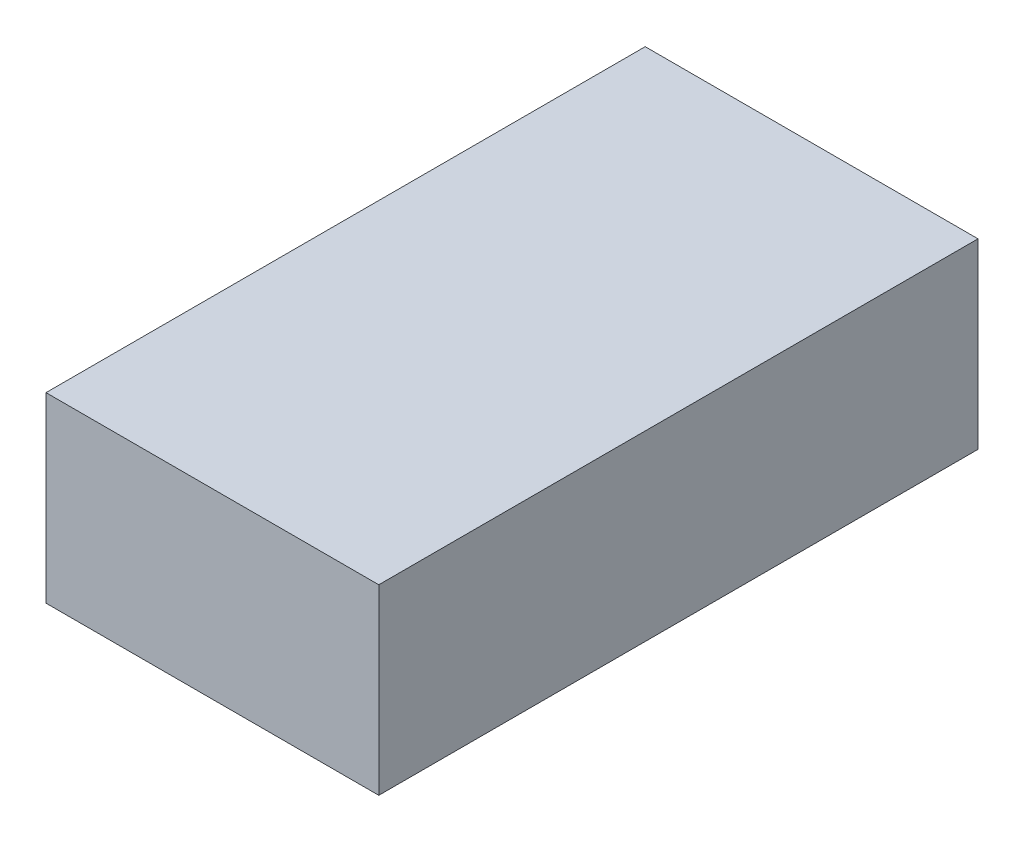
ISO-10303-21;
HEADER;
FILE_DESCRIPTION(('STEP AP214'),'2;1');
FILE_NAME('part.step','',(''),(''),'','','');
FILE_SCHEMA(('AUTOMOTIVE_DESIGN { 1 0 10303 214 1 1 1 1 }'));
ENDSEC;
DATA;
#1=APPLICATION_CONTEXT('core data for automotive mechanical design processes');
#2=APPLICATION_PROTOCOL_DEFINITION('international standard','automotive_design',2000,#1);
#3=PRODUCT_CONTEXT('',#1,'mechanical');
#4=PRODUCT('Part','Part','',(#3));
#5=PRODUCT_RELATED_PRODUCT_CATEGORY('part','',(#4));
#6=PRODUCT_DEFINITION_FORMATION('','',#4);
#7=PRODUCT_DEFINITION_CONTEXT('part definition',#1,'design');
#8=PRODUCT_DEFINITION('design','',#6,#7);
#9=PRODUCT_DEFINITION_SHAPE('','',#8);
#10=(LENGTH_UNIT() NAMED_UNIT(*) SI_UNIT(.MILLI.,.METRE.));
#11=(NAMED_UNIT(*) PLANE_ANGLE_UNIT() SI_UNIT($,.RADIAN.));
#12=(NAMED_UNIT(*) SI_UNIT($,.STERADIAN.) SOLID_ANGLE_UNIT());
#13=UNCERTAINTY_MEASURE_WITH_UNIT(LENGTH_MEASURE(1.E-05),#10,'distance_accuracy_value','');
#14=(GEOMETRIC_REPRESENTATION_CONTEXT(3) GLOBAL_UNCERTAINTY_ASSIGNED_CONTEXT((#13)) GLOBAL_UNIT_ASSIGNED_CONTEXT((#10,
#11,#12)) REPRESENTATION_CONTEXT('',''));
#15=CARTESIAN_POINT('',(0.,0.,0.));
#16=DIRECTION('',(0.,0.,1.));
#17=DIRECTION('',(1.,0.,0.));
#18=AXIS2_PLACEMENT_3D('',#15,#16,#17);
#19=CARTESIAN_POINT('',(-20.0525,15.5175,57.113));
#20=DIRECTION('',(1.,0.,0.));
#21=DIRECTION('',(0.,0.,-1.));
#22=AXIS2_PLACEMENT_3D('',#19,#20,#21);
#23=PLANE('',#22);
#24=DIRECTION('',(0.,-1.,0.));
#25=VECTOR('',#24,1.);
#26=CARTESIAN_POINT('',(-20.0525,15.5175,0.));
#27=LINE('',#26,#25);
#28=CARTESIAN_POINT('',(-20.0525,15.5175,0.));
#29=VERTEX_POINT('',#28);
#30=CARTESIAN_POINT('',(-20.0525,-1.8635,0.));
#31=VERTEX_POINT('',#30);
#32=EDGE_CURVE('E101',#29,#31,#27,.T.);
#33=ORIENTED_EDGE('',*,*,#32,.T.);
#34=DIRECTION('',(0.,0.,-1.));
#35=VECTOR('',#34,1.);
#36=CARTESIAN_POINT('',(-20.0525,-1.8635,57.113));
#37=LINE('',#36,#35);
#38=CARTESIAN_POINT('',(-20.0525,-1.8635,57.113));
#39=VERTEX_POINT('',#38);
#40=EDGE_CURVE('E11',#39,#31,#37,.T.);
#41=ORIENTED_EDGE('',*,*,#40,.F.);
#42=DIRECTION('',(0.,-1.,0.));
#43=VECTOR('',#42,1.);
#44=CARTESIAN_POINT('',(-20.0525,15.5175,57.113));
#45=LINE('',#44,#43);
#46=CARTESIAN_POINT('',(-20.0525,15.5175,57.113));
#47=VERTEX_POINT('',#46);
#48=EDGE_CURVE('E95',#47,#39,#45,.T.);
#49=ORIENTED_EDGE('',*,*,#48,.F.);
#50=DIRECTION('',(0.,0.,-1.));
#51=VECTOR('',#50,1.);
#52=CARTESIAN_POINT('',(-20.0525,15.5175,57.113));
#53=LINE('',#52,#51);
#54=EDGE_CURVE('E99',#47,#29,#53,.T.);
#55=ORIENTED_EDGE('',*,*,#54,.T.);
#56=EDGE_LOOP('',(#33,#41,#49,#55));
#57=FACE_BOUND('',#56,.T.);
#58=ADVANCED_FACE('F41',(#57),#23,.F.);
#59=CARTESIAN_POINT('',(-20.0525,-1.8635,57.113));
#60=DIRECTION('',(0.,1.,0.));
#61=DIRECTION('',(0.,0.,1.));
#62=AXIS2_PLACEMENT_3D('',#59,#60,#61);
#63=PLANE('',#62);
#64=DIRECTION('',(1.,0.,0.));
#65=VECTOR('',#64,1.);
#66=CARTESIAN_POINT('',(-20.0525,-1.8635,0.));
#67=LINE('',#66,#65);
#68=CARTESIAN_POINT('',(11.6665,-1.8635,0.));
#69=VERTEX_POINT('',#68);
#70=EDGE_CURVE('E96',#31,#69,#67,.T.);
#71=ORIENTED_EDGE('',*,*,#70,.T.);
#72=DIRECTION('',(0.,0.,-1.));
#73=VECTOR('',#72,1.);
#74=CARTESIAN_POINT('',(11.6665,-1.8635,57.113));
#75=LINE('',#74,#73);
#76=CARTESIAN_POINT('',(11.6665,-1.8635,57.113));
#77=VERTEX_POINT('',#76);
#78=EDGE_CURVE('E47',#77,#69,#75,.T.);
#79=ORIENTED_EDGE('',*,*,#78,.F.);
#80=DIRECTION('',(1.,0.,0.));
#81=VECTOR('',#80,1.);
#82=CARTESIAN_POINT('',(-20.0525,-1.8635,57.113));
#83=LINE('',#82,#81);
#84=EDGE_CURVE('E90',#39,#77,#83,.T.);
#85=ORIENTED_EDGE('',*,*,#84,.F.);
#86=ORIENTED_EDGE('',*,*,#40,.T.);
#87=EDGE_LOOP('',(#71,#79,#85,#86));
#88=FACE_BOUND('',#87,.T.);
#89=ADVANCED_FACE('F94',(#88),#63,.F.);
#90=CARTESIAN_POINT('',(11.6665,-1.8635,57.113));
#91=DIRECTION('',(-1.,0.,0.));
#92=DIRECTION('',(0.,0.,1.));
#93=AXIS2_PLACEMENT_3D('',#90,#91,#92);
#94=PLANE('',#93);
#95=DIRECTION('',(0.,1.,0.));
#96=VECTOR('',#95,1.);
#97=CARTESIAN_POINT('',(11.6665,-1.8635,0.));
#98=LINE('',#97,#96);
#99=CARTESIAN_POINT('',(11.6665,15.5175,0.));
#100=VERTEX_POINT('',#99);
#101=EDGE_CURVE('E71',#69,#100,#98,.T.);
#102=ORIENTED_EDGE('',*,*,#101,.T.);
#103=DIRECTION('',(0.,0.,-1.));
#104=VECTOR('',#103,1.);
#105=CARTESIAN_POINT('',(11.6665,15.5175,57.113));
#106=LINE('',#105,#104);
#107=CARTESIAN_POINT('',(11.6665,15.5175,57.113));
#108=VERTEX_POINT('',#107);
#109=EDGE_CURVE('E100',#108,#100,#106,.T.);
#110=ORIENTED_EDGE('',*,*,#109,.F.);
#111=DIRECTION('',(0.,1.,0.));
#112=VECTOR('',#111,1.);
#113=CARTESIAN_POINT('',(11.6665,-1.8635,57.113));
#114=LINE('',#113,#112);
#115=EDGE_CURVE('E89',#77,#108,#114,.T.);
#116=ORIENTED_EDGE('',*,*,#115,.F.);
#117=ORIENTED_EDGE('',*,*,#78,.T.);
#118=EDGE_LOOP('',(#102,#110,#116,#117));
#119=FACE_BOUND('',#118,.T.);
#120=ADVANCED_FACE('F97',(#119),#94,.F.);
#121=CARTESIAN_POINT('',(11.6665,15.5175,57.113));
#122=DIRECTION('',(0.,-1.,0.));
#123=DIRECTION('',(0.,0.,-1.));
#124=AXIS2_PLACEMENT_3D('',#121,#122,#123);
#125=PLANE('',#124);
#126=DIRECTION('',(-1.,0.,0.));
#127=VECTOR('',#126,1.);
#128=CARTESIAN_POINT('',(11.6665,15.5175,0.));
#129=LINE('',#128,#127);
#130=EDGE_CURVE('E79',#100,#29,#129,.T.);
#131=ORIENTED_EDGE('',*,*,#130,.T.);
#132=ORIENTED_EDGE('',*,*,#54,.F.);
#133=DIRECTION('',(-1.,0.,0.));
#134=VECTOR('',#133,1.);
#135=CARTESIAN_POINT('',(11.6665,15.5175,57.113));
#136=LINE('',#135,#134);
#137=EDGE_CURVE('E60',#108,#47,#136,.T.);
#138=ORIENTED_EDGE('',*,*,#137,.F.);
#139=ORIENTED_EDGE('',*,*,#109,.T.);
#140=EDGE_LOOP('',(#131,#132,#138,#139));
#141=FACE_BOUND('',#140,.T.);
#142=ADVANCED_FACE('F112',(#141),#125,.F.);
#143=CARTESIAN_POINT('',(0.,0.,57.113));
#144=DIRECTION('',(0.,0.,1.));
#145=DIRECTION('',(1.,0.,0.));
#146=AXIS2_PLACEMENT_3D('',#143,#144,#145);
#147=PLANE('',#146);
#148=ORIENTED_EDGE('',*,*,#48,.T.);
#149=ORIENTED_EDGE('',*,*,#84,.T.);
#150=ORIENTED_EDGE('',*,*,#115,.T.);
#151=ORIENTED_EDGE('',*,*,#137,.T.);
#152=EDGE_LOOP('',(#148,#149,#150,#151));
#153=FACE_BOUND('',#152,.T.);
#154=ADVANCED_FACE('F88',(#153),#147,.T.);
#155=CARTESIAN_POINT('',(0.,0.,0.));
#156=DIRECTION('',(0.,0.,1.));
#157=DIRECTION('',(1.,0.,0.));
#158=AXIS2_PLACEMENT_3D('',#155,#156,#157);
#159=PLANE('',#158);
#160=ORIENTED_EDGE('',*,*,#32,.F.);
#161=ORIENTED_EDGE('',*,*,#130,.F.);
#162=ORIENTED_EDGE('',*,*,#101,.F.);
#163=ORIENTED_EDGE('',*,*,#70,.F.);
#164=EDGE_LOOP('',(#160,#161,#162,#163));
#165=FACE_BOUND('',#164,.T.);
#166=ADVANCED_FACE('F114',(#165),#159,.F.);
#167=CLOSED_SHELL('',(#58,#89,#120,#142,#154,#166));
#168=MANIFOLD_SOLID_BREP('B2',#167);
#169=ADVANCED_BREP_SHAPE_REPRESENTATION('',(#18,#168),#14);
#170=SHAPE_DEFINITION_REPRESENTATION(#9,#169);
ENDSEC;
END-ISO-10303-21;
